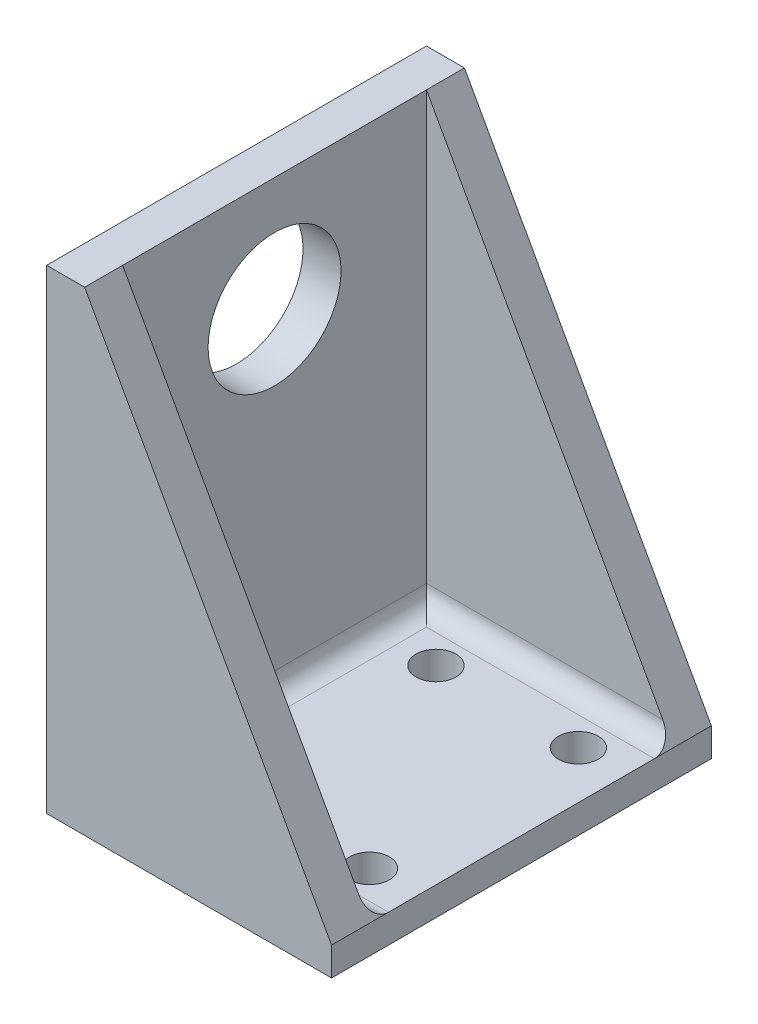
ISO-10303-21;
HEADER;
FILE_DESCRIPTION(('STEP AP214'),'2;1');
FILE_NAME('part.step','',(''),(''),'','','');
FILE_SCHEMA(('AUTOMOTIVE_DESIGN { 1 0 10303 214 1 1 1 1 }'));
ENDSEC;
DATA;
#1=APPLICATION_CONTEXT('core data for automotive mechanical design processes');
#2=APPLICATION_PROTOCOL_DEFINITION('international standard','automotive_design',2000,#1);
#3=PRODUCT_CONTEXT('',#1,'mechanical');
#4=PRODUCT('Part','Part','',(#3));
#5=PRODUCT_RELATED_PRODUCT_CATEGORY('part','',(#4));
#6=PRODUCT_DEFINITION_FORMATION('','',#4);
#7=PRODUCT_DEFINITION_CONTEXT('part definition',#1,'design');
#8=PRODUCT_DEFINITION('design','',#6,#7);
#9=PRODUCT_DEFINITION_SHAPE('','',#8);
#10=(LENGTH_UNIT() NAMED_UNIT(*) SI_UNIT(.MILLI.,.METRE.));
#11=(NAMED_UNIT(*) PLANE_ANGLE_UNIT() SI_UNIT($,.RADIAN.));
#12=(NAMED_UNIT(*) SI_UNIT($,.STERADIAN.) SOLID_ANGLE_UNIT());
#13=UNCERTAINTY_MEASURE_WITH_UNIT(LENGTH_MEASURE(1.E-05),#10,'distance_accuracy_value','');
#14=(GEOMETRIC_REPRESENTATION_CONTEXT(3) GLOBAL_UNCERTAINTY_ASSIGNED_CONTEXT((#13)) GLOBAL_UNIT_ASSIGNED_CONTEXT((#10,
#11,#12)) REPRESENTATION_CONTEXT('',''));
#15=CARTESIAN_POINT('',(0.,0.,0.));
#16=DIRECTION('',(0.,0.,1.));
#17=DIRECTION('',(1.,0.,0.));
#18=AXIS2_PLACEMENT_3D('',#15,#16,#17);
#19=CARTESIAN_POINT('',(0.,3.,0.));
#20=DIRECTION('',(0.,-1.,0.));
#21=DIRECTION('',(0.,0.,-1.));
#22=AXIS2_PLACEMENT_3D('',#19,#20,#21);
#23=PLANE('',#22);
#24=CARTESIAN_POINT('',(0.,3.,-11.));
#25=DIRECTION('',(0.,1.,0.));
#26=DIRECTION('',(0.,0.,1.));
#27=AXIS2_PLACEMENT_3D('',#24,#25,#26);
#28=CIRCLE('',#27,2.1);
#29=CARTESIAN_POINT('',(0.,3.,-8.90000000000001));
#30=VERTEX_POINT('',#29);
#31=EDGE_CURVE('E200',#30,#30,#28,.T.);
#32=ORIENTED_EDGE('',*,*,#31,.F.);
#33=EDGE_LOOP('',(#32));
#34=FACE_BOUND('',#33,.T.);
#35=CARTESIAN_POINT('',(15.,3.,11.));
#36=DIRECTION('',(0.,1.,0.));
#37=DIRECTION('',(0.,0.,1.));
#38=AXIS2_PLACEMENT_3D('',#35,#36,#37);
#39=CIRCLE('',#38,2.1);
#40=CARTESIAN_POINT('',(15.,3.,13.1));
#41=VERTEX_POINT('',#40);
#42=EDGE_CURVE('E192',#41,#41,#39,.T.);
#43=ORIENTED_EDGE('',*,*,#42,.F.);
#44=EDGE_LOOP('',(#43));
#45=FACE_BOUND('',#44,.T.);
#46=CARTESIAN_POINT('',(15.,3.,-11.));
#47=DIRECTION('',(0.,1.,0.));
#48=DIRECTION('',(0.,0.,-1.));
#49=AXIS2_PLACEMENT_3D('',#46,#47,#48);
#50=CIRCLE('',#49,2.1);
#51=CARTESIAN_POINT('',(15.,3.,-13.1));
#52=VERTEX_POINT('',#51);
#53=EDGE_CURVE('E184',#52,#52,#50,.T.);
#54=ORIENTED_EDGE('',*,*,#53,.F.);
#55=EDGE_LOOP('',(#54));
#56=FACE_BOUND('',#55,.T.);
#57=CARTESIAN_POINT('',(0.,3.,11.));
#58=DIRECTION('',(0.,1.,0.));
#59=DIRECTION('',(0.,0.,-1.));
#60=AXIS2_PLACEMENT_3D('',#57,#58,#59);
#61=CIRCLE('',#60,2.1);
#62=CARTESIAN_POINT('',(0.,3.,8.90000000000001));
#63=VERTEX_POINT('',#62);
#64=EDGE_CURVE('E176',#63,#63,#61,.T.);
#65=ORIENTED_EDGE('',*,*,#64,.F.);
#66=EDGE_LOOP('',(#65));
#67=FACE_BOUND('',#66,.T.);
#68=DIRECTION('',(0.,0.,-1.));
#69=VECTOR('',#68,1.);
#70=CARTESIAN_POINT('',(20.,3.,20.));
#71=LINE('',#70,#69);
#72=CARTESIAN_POINT('',(20.,3.,14.));
#73=VERTEX_POINT('',#72);
#74=CARTESIAN_POINT('',(20.,3.,-14.));
#75=VERTEX_POINT('',#74);
#76=EDGE_CURVE('E213',#73,#75,#71,.T.);
#77=ORIENTED_EDGE('',*,*,#76,.T.);
#78=DIRECTION('',(1.,0.,0.));
#79=VECTOR('',#78,1.);
#80=CARTESIAN_POINT('',(-5.99999999999999,3.,-14.));
#81=LINE('',#80,#79);
#82=CARTESIAN_POINT('',(-3.99999999999999,3.,-14.));
#83=VERTEX_POINT('',#82);
#84=EDGE_CURVE('E248',#75,#83,#81,.F.);
#85=ORIENTED_EDGE('',*,*,#84,.T.);
#86=DIRECTION('',(0.,0.,1.));
#87=VECTOR('',#86,1.);
#88=CARTESIAN_POINT('',(-3.99999999999999,3.,0.));
#89=LINE('',#88,#87);
#90=CARTESIAN_POINT('',(-3.99999999999999,3.,14.));
#91=VERTEX_POINT('',#90);
#92=EDGE_CURVE('E244',#83,#91,#89,.T.);
#93=ORIENTED_EDGE('',*,*,#92,.T.);
#94=DIRECTION('',(-1.,0.,0.));
#95=VECTOR('',#94,1.);
#96=CARTESIAN_POINT('',(20.,3.,14.));
#97=LINE('',#96,#95);
#98=EDGE_CURVE('E240',#91,#73,#97,.F.);
#99=ORIENTED_EDGE('',*,*,#98,.T.);
#100=EDGE_LOOP('',(#77,#85,#93,#99));
#101=FACE_BOUND('',#100,.T.);
#102=ADVANCED_FACE('F45',(#34,#45,#56,#67,#101),#23,.F.);
#103=CARTESIAN_POINT('',(-5.99999999999999,0.,0.));
#104=DIRECTION('',(1.,0.,0.));
#105=DIRECTION('',(0.,0.,-1.));
#106=AXIS2_PLACEMENT_3D('',#103,#104,#105);
#107=PLANE('',#106);
#108=CARTESIAN_POINT('',(-5.99999999999999,38.,0.));
#109=DIRECTION('',(-1.,0.,0.));
#110=DIRECTION('',(0.,0.,1.));
#111=AXIS2_PLACEMENT_3D('',#108,#109,#110);
#112=CIRCLE('',#111,7.);
#113=CARTESIAN_POINT('',(-5.99999999999999,38.,6.99999999999999));
#114=VERTEX_POINT('',#113);
#115=EDGE_CURVE('E163',#114,#114,#112,.T.);
#116=ORIENTED_EDGE('',*,*,#115,.T.);
#117=EDGE_LOOP('',(#116));
#118=FACE_BOUND('',#117,.T.);
#119=DIRECTION('',(0.,-1.,0.));
#120=VECTOR('',#119,1.);
#121=CARTESIAN_POINT('',(-5.99999999999999,0.,16.));
#122=LINE('',#121,#120);
#123=CARTESIAN_POINT('',(-5.99999999999999,50.,16.));
#124=VERTEX_POINT('',#123);
#125=CARTESIAN_POINT('',(-5.99999999999999,5.,16.));
#126=VERTEX_POINT('',#125);
#127=EDGE_CURVE('E276',#124,#126,#122,.T.);
#128=ORIENTED_EDGE('',*,*,#127,.T.);
#129=DIRECTION('',(0.,0.,1.));
#130=VECTOR('',#129,1.);
#131=CARTESIAN_POINT('',(-5.99999999999999,5.,0.));
#132=LINE('',#131,#130);
#133=CARTESIAN_POINT('',(-5.99999999999999,5.,-16.));
#134=VERTEX_POINT('',#133);
#135=EDGE_CURVE('E142',#126,#134,#132,.F.);
#136=ORIENTED_EDGE('',*,*,#135,.T.);
#137=DIRECTION('',(0.,1.,0.));
#138=VECTOR('',#137,1.);
#139=CARTESIAN_POINT('',(-5.99999999999999,0.,-16.));
#140=LINE('',#139,#138);
#141=CARTESIAN_POINT('',(-5.99999999999999,50.,-16.));
#142=VERTEX_POINT('',#141);
#143=EDGE_CURVE('E123',#134,#142,#140,.T.);
#144=ORIENTED_EDGE('',*,*,#143,.T.);
#145=DIRECTION('',(0.,0.,-1.));
#146=VECTOR('',#145,1.);
#147=CARTESIAN_POINT('',(-5.99999999999999,50.,-20.));
#148=LINE('',#147,#146);
#149=EDGE_CURVE('E139',#124,#142,#148,.T.);
#150=ORIENTED_EDGE('',*,*,#149,.F.);
#151=EDGE_LOOP('',(#128,#136,#144,#150));
#152=FACE_BOUND('',#151,.T.);
#153=ADVANCED_FACE('F137',(#118,#152),#107,.T.);
#154=CARTESIAN_POINT('',(0.,0.,0.));
#155=DIRECTION('',(0.,-1.,0.));
#156=DIRECTION('',(0.,0.,-1.));
#157=AXIS2_PLACEMENT_3D('',#154,#155,#156);
#158=PLANE('',#157);
#159=DIRECTION('',(-1.,0.,0.));
#160=VECTOR('',#159,1.);
#161=CARTESIAN_POINT('',(-9.99999999999999,0.,-20.));
#162=LINE('',#161,#160);
#163=CARTESIAN_POINT('',(20.,0.,-20.));
#164=VERTEX_POINT('',#163);
#165=CARTESIAN_POINT('',(-9.99999999999999,0.,-20.));
#166=VERTEX_POINT('',#165);
#167=EDGE_CURVE('E216',#164,#166,#162,.T.);
#168=ORIENTED_EDGE('',*,*,#167,.F.);
#169=DIRECTION('',(0.,0.,-1.));
#170=VECTOR('',#169,1.);
#171=CARTESIAN_POINT('',(20.,0.,20.));
#172=LINE('',#171,#170);
#173=CARTESIAN_POINT('',(20.,0.,20.));
#174=VERTEX_POINT('',#173);
#175=EDGE_CURVE('E204',#174,#164,#172,.T.);
#176=ORIENTED_EDGE('',*,*,#175,.F.);
#177=DIRECTION('',(1.,0.,0.));
#178=VECTOR('',#177,1.);
#179=CARTESIAN_POINT('',(-9.99999999999998,0.,20.));
#180=LINE('',#179,#178);
#181=CARTESIAN_POINT('',(-9.99999999999998,0.,20.));
#182=VERTEX_POINT('',#181);
#183=EDGE_CURVE('E222',#182,#174,#180,.T.);
#184=ORIENTED_EDGE('',*,*,#183,.F.);
#185=DIRECTION('',(0.,0.,1.));
#186=VECTOR('',#185,1.);
#187=CARTESIAN_POINT('',(-9.99999999999999,0.,-20.));
#188=LINE('',#187,#186);
#189=EDGE_CURVE('E219',#166,#182,#188,.T.);
#190=ORIENTED_EDGE('',*,*,#189,.F.);
#191=EDGE_LOOP('',(#168,#176,#184,#190));
#192=FACE_BOUND('',#191,.T.);
#193=CARTESIAN_POINT('',(15.,0.,-11.));
#194=DIRECTION('',(0.,1.,0.));
#195=DIRECTION('',(0.,0.,-1.));
#196=AXIS2_PLACEMENT_3D('',#193,#194,#195);
#197=CIRCLE('',#196,2.1);
#198=CARTESIAN_POINT('',(15.,0.,-13.1));
#199=VERTEX_POINT('',#198);
#200=EDGE_CURVE('E180',#199,#199,#197,.T.);
#201=ORIENTED_EDGE('',*,*,#200,.T.);
#202=EDGE_LOOP('',(#201));
#203=FACE_BOUND('',#202,.T.);
#204=CARTESIAN_POINT('',(0.,0.,-11.));
#205=DIRECTION('',(0.,1.,0.));
#206=DIRECTION('',(0.,0.,1.));
#207=AXIS2_PLACEMENT_3D('',#204,#205,#206);
#208=CIRCLE('',#207,2.1);
#209=CARTESIAN_POINT('',(0.,0.,-8.90000000000001));
#210=VERTEX_POINT('',#209);
#211=EDGE_CURVE('E196',#210,#210,#208,.T.);
#212=ORIENTED_EDGE('',*,*,#211,.T.);
#213=EDGE_LOOP('',(#212));
#214=FACE_BOUND('',#213,.T.);
#215=CARTESIAN_POINT('',(15.,0.,11.));
#216=DIRECTION('',(0.,1.,0.));
#217=DIRECTION('',(0.,0.,1.));
#218=AXIS2_PLACEMENT_3D('',#215,#216,#217);
#219=CIRCLE('',#218,2.1);
#220=CARTESIAN_POINT('',(15.,0.,13.1));
#221=VERTEX_POINT('',#220);
#222=EDGE_CURVE('E188',#221,#221,#219,.T.);
#223=ORIENTED_EDGE('',*,*,#222,.T.);
#224=EDGE_LOOP('',(#223));
#225=FACE_BOUND('',#224,.T.);
#226=CARTESIAN_POINT('',(0.,0.,11.));
#227=DIRECTION('',(0.,1.,0.));
#228=DIRECTION('',(0.,0.,-1.));
#229=AXIS2_PLACEMENT_3D('',#226,#227,#228);
#230=CIRCLE('',#229,2.1);
#231=CARTESIAN_POINT('',(0.,0.,8.90000000000001));
#232=VERTEX_POINT('',#231);
#233=EDGE_CURVE('E172',#232,#232,#230,.T.);
#234=ORIENTED_EDGE('',*,*,#233,.T.);
#235=EDGE_LOOP('',(#234));
#236=FACE_BOUND('',#235,.T.);
#237=ADVANCED_FACE('F314',(#192,#203,#214,#225,#236),#158,.T.);
#238=CARTESIAN_POINT('',(20.,3.,20.));
#239=DIRECTION('',(-1.,0.,0.));
#240=DIRECTION('',(0.,0.,1.));
#241=AXIS2_PLACEMENT_3D('',#238,#239,#240);
#242=PLANE('',#241);
#243=DIRECTION('',(0.,0.,-1.));
#244=VECTOR('',#243,1.);
#245=CARTESIAN_POINT('',(20.,3.,-16.));
#246=LINE('',#245,#244);
#247=CARTESIAN_POINT('',(20.,3.,-20.));
#248=VERTEX_POINT('',#247);
#249=EDGE_CURVE('E64',#75,#248,#246,.T.);
#250=ORIENTED_EDGE('',*,*,#249,.F.);
#251=ORIENTED_EDGE('',*,*,#76,.F.);
#252=CARTESIAN_POINT('',(20.,3.,20.));
#253=VERTEX_POINT('',#252);
#254=EDGE_CURVE('E208',#253,#73,#71,.T.);
#255=ORIENTED_EDGE('',*,*,#254,.F.);
#256=DIRECTION('',(0.,-1.,0.));
#257=VECTOR('',#256,1.);
#258=CARTESIAN_POINT('',(20.,3.,20.));
#259=LINE('',#258,#257);
#260=EDGE_CURVE('E212',#253,#174,#259,.T.);
#261=ORIENTED_EDGE('',*,*,#260,.T.);
#262=ORIENTED_EDGE('',*,*,#175,.T.);
#263=DIRECTION('',(0.,-1.,0.));
#264=VECTOR('',#263,1.);
#265=CARTESIAN_POINT('',(20.,3.,-20.));
#266=LINE('',#265,#264);
#267=EDGE_CURVE('E236',#248,#164,#266,.T.);
#268=ORIENTED_EDGE('',*,*,#267,.F.);
#269=EDGE_LOOP('',(#250,#251,#255,#261,#262,#268));
#270=FACE_BOUND('',#269,.T.);
#271=ADVANCED_FACE('F305',(#270),#242,.F.);
#272=CARTESIAN_POINT('',(-9.99999999999999,3.,-20.));
#273=DIRECTION('',(0.,0.,1.));
#274=DIRECTION('',(1.,0.,0.));
#275=AXIS2_PLACEMENT_3D('',#272,#273,#274);
#276=PLANE('',#275);
#277=ORIENTED_EDGE('',*,*,#167,.T.);
#278=DIRECTION('',(0.,-1.,0.));
#279=VECTOR('',#278,1.);
#280=CARTESIAN_POINT('',(-9.99999999999999,3.,-20.));
#281=LINE('',#280,#279);
#282=CARTESIAN_POINT('',(-9.99999999999999,50.,-20.));
#283=VERTEX_POINT('',#282);
#284=EDGE_CURVE('E232',#283,#166,#281,.T.);
#285=ORIENTED_EDGE('',*,*,#284,.F.);
#286=DIRECTION('',(-1.,0.,0.));
#287=VECTOR('',#286,1.);
#288=CARTESIAN_POINT('',(-5.99999999999999,50.,-20.));
#289=LINE('',#288,#287);
#290=CARTESIAN_POINT('',(-5.99999999999999,50.,-20.));
#291=VERTEX_POINT('',#290);
#292=EDGE_CURVE('E169',#291,#283,#289,.T.);
#293=ORIENTED_EDGE('',*,*,#292,.F.);
#294=DIRECTION('',(-0.484061385167266,0.87503404241775,0.));
#295=VECTOR('',#294,1.);
#296=CARTESIAN_POINT('',(20.,3.,-20.));
#297=LINE('',#296,#295);
#298=EDGE_CURVE('E132',#248,#291,#297,.T.);
#299=ORIENTED_EDGE('',*,*,#298,.F.);
#300=ORIENTED_EDGE('',*,*,#267,.T.);
#301=EDGE_LOOP('',(#277,#285,#293,#299,#300));
#302=FACE_BOUND('',#301,.T.);
#303=ADVANCED_FACE('F294',(#302),#276,.F.);
#304=CARTESIAN_POINT('',(-9.99999999999999,3.,-20.));
#305=DIRECTION('',(1.,0.,0.));
#306=DIRECTION('',(0.,0.,-1.));
#307=AXIS2_PLACEMENT_3D('',#304,#305,#306);
#308=PLANE('',#307);
#309=ORIENTED_EDGE('',*,*,#189,.T.);
#310=DIRECTION('',(0.,-1.,0.));
#311=VECTOR('',#310,1.);
#312=CARTESIAN_POINT('',(-9.99999999999998,3.,20.));
#313=LINE('',#312,#311);
#314=CARTESIAN_POINT('',(-9.99999999999999,50.,20.));
#315=VERTEX_POINT('',#314);
#316=EDGE_CURVE('E228',#315,#182,#313,.T.);
#317=ORIENTED_EDGE('',*,*,#316,.F.);
#318=DIRECTION('',(0.,0.,-1.));
#319=VECTOR('',#318,1.);
#320=CARTESIAN_POINT('',(-9.99999999999999,50.,-20.));
#321=LINE('',#320,#319);
#322=EDGE_CURVE('E158',#315,#283,#321,.T.);
#323=ORIENTED_EDGE('',*,*,#322,.T.);
#324=ORIENTED_EDGE('',*,*,#284,.T.);
#325=EDGE_LOOP('',(#309,#317,#323,#324));
#326=FACE_BOUND('',#325,.T.);
#327=CARTESIAN_POINT('',(-9.99999999999999,38.,0.));
#328=DIRECTION('',(-1.,0.,0.));
#329=DIRECTION('',(0.,0.,1.));
#330=AXIS2_PLACEMENT_3D('',#327,#328,#329);
#331=CIRCLE('',#330,7.);
#332=CARTESIAN_POINT('',(-9.99999999999999,38.,6.99999999999999));
#333=VERTEX_POINT('',#332);
#334=EDGE_CURVE('E166',#333,#333,#331,.T.);
#335=ORIENTED_EDGE('',*,*,#334,.F.);
#336=EDGE_LOOP('',(#335));
#337=FACE_BOUND('',#336,.T.);
#338=ADVANCED_FACE('F291',(#326,#337),#308,.F.);
#339=CARTESIAN_POINT('',(-9.99999999999998,3.,20.));
#340=DIRECTION('',(0.,0.,-1.));
#341=DIRECTION('',(-1.,0.,0.));
#342=AXIS2_PLACEMENT_3D('',#339,#340,#341);
#343=PLANE('',#342);
#344=ORIENTED_EDGE('',*,*,#260,.F.);
#345=DIRECTION('',(-0.484061385167266,0.87503404241775,0.));
#346=VECTOR('',#345,1.);
#347=CARTESIAN_POINT('',(20.,3.,20.));
#348=LINE('',#347,#346);
#349=CARTESIAN_POINT('',(-5.99999999999999,50.,20.));
#350=VERTEX_POINT('',#349);
#351=EDGE_CURVE('E144',#253,#350,#348,.T.);
#352=ORIENTED_EDGE('',*,*,#351,.T.);
#353=DIRECTION('',(-1.,0.,0.));
#354=VECTOR('',#353,1.);
#355=CARTESIAN_POINT('',(-5.99999999999999,50.,20.));
#356=LINE('',#355,#354);
#357=EDGE_CURVE('E162',#350,#315,#356,.T.);
#358=ORIENTED_EDGE('',*,*,#357,.T.);
#359=ORIENTED_EDGE('',*,*,#316,.T.);
#360=ORIENTED_EDGE('',*,*,#183,.T.);
#361=EDGE_LOOP('',(#344,#352,#358,#359,#360));
#362=FACE_BOUND('',#361,.T.);
#363=ADVANCED_FACE('F293',(#362),#343,.F.);
#364=CARTESIAN_POINT('',(0.,3.,-11.));
#365=DIRECTION('',(0.,-1.,0.));
#366=DIRECTION('',(0.,0.,-1.));
#367=AXIS2_PLACEMENT_3D('',#364,#365,#366);
#368=CYLINDRICAL_SURFACE('',#367,2.1);
#369=ORIENTED_EDGE('',*,*,#31,.T.);
#370=EDGE_LOOP('',(#369));
#371=FACE_BOUND('',#370,.T.);
#372=ORIENTED_EDGE('',*,*,#211,.F.);
#373=EDGE_LOOP('',(#372));
#374=FACE_BOUND('',#373,.T.);
#375=ADVANCED_FACE('F302',(#371,#374),#368,.F.);
#376=CARTESIAN_POINT('',(15.,3.,11.));
#377=DIRECTION('',(0.,-1.,0.));
#378=DIRECTION('',(0.,0.,-1.));
#379=AXIS2_PLACEMENT_3D('',#376,#377,#378);
#380=CYLINDRICAL_SURFACE('',#379,2.1);
#381=ORIENTED_EDGE('',*,*,#42,.T.);
#382=EDGE_LOOP('',(#381));
#383=FACE_BOUND('',#382,.T.);
#384=ORIENTED_EDGE('',*,*,#222,.F.);
#385=EDGE_LOOP('',(#384));
#386=FACE_BOUND('',#385,.T.);
#387=ADVANCED_FACE('F349',(#383,#386),#380,.F.);
#388=CARTESIAN_POINT('',(15.,3.,-11.));
#389=DIRECTION('',(0.,-1.,0.));
#390=DIRECTION('',(0.,0.,-1.));
#391=AXIS2_PLACEMENT_3D('',#388,#389,#390);
#392=CYLINDRICAL_SURFACE('',#391,2.1);
#393=ORIENTED_EDGE('',*,*,#53,.T.);
#394=EDGE_LOOP('',(#393));
#395=FACE_BOUND('',#394,.T.);
#396=ORIENTED_EDGE('',*,*,#200,.F.);
#397=EDGE_LOOP('',(#396));
#398=FACE_BOUND('',#397,.T.);
#399=ADVANCED_FACE('F341',(#395,#398),#392,.F.);
#400=CARTESIAN_POINT('',(0.,3.,11.));
#401=DIRECTION('',(0.,-1.,0.));
#402=DIRECTION('',(0.,0.,-1.));
#403=AXIS2_PLACEMENT_3D('',#400,#401,#402);
#404=CYLINDRICAL_SURFACE('',#403,2.1);
#405=ORIENTED_EDGE('',*,*,#64,.T.);
#406=EDGE_LOOP('',(#405));
#407=FACE_BOUND('',#406,.T.);
#408=ORIENTED_EDGE('',*,*,#233,.F.);
#409=EDGE_LOOP('',(#408));
#410=FACE_BOUND('',#409,.T.);
#411=ADVANCED_FACE('F339',(#407,#410),#404,.F.);
#412=CARTESIAN_POINT('',(-5.99999999999999,50.,-20.));
#413=DIRECTION('',(0.,1.,0.));
#414=DIRECTION('',(0.,0.,1.));
#415=AXIS2_PLACEMENT_3D('',#412,#413,#414);
#416=PLANE('',#415);
#417=ORIENTED_EDGE('',*,*,#292,.T.);
#418=ORIENTED_EDGE('',*,*,#322,.F.);
#419=ORIENTED_EDGE('',*,*,#357,.F.);
#420=EDGE_CURVE('E156',#350,#124,#148,.T.);
#421=ORIENTED_EDGE('',*,*,#420,.T.);
#422=ORIENTED_EDGE('',*,*,#149,.T.);
#423=DIRECTION('',(0.,0.,-1.));
#424=VECTOR('',#423,1.);
#425=CARTESIAN_POINT('',(-5.99999999999999,50.,-16.));
#426=LINE('',#425,#424);
#427=EDGE_CURVE('E131',#142,#291,#426,.T.);
#428=ORIENTED_EDGE('',*,*,#427,.T.);
#429=EDGE_LOOP('',(#417,#418,#419,#421,#422,#428));
#430=FACE_BOUND('',#429,.T.);
#431=ADVANCED_FACE('F154',(#430),#416,.T.);
#432=CARTESIAN_POINT('',(-5.99999999999999,38.,0.));
#433=DIRECTION('',(-1.,0.,0.));
#434=DIRECTION('',(0.,0.,1.));
#435=AXIS2_PLACEMENT_3D('',#432,#433,#434);
#436=CYLINDRICAL_SURFACE('',#435,7.);
#437=ORIENTED_EDGE('',*,*,#115,.F.);
#438=EDGE_LOOP('',(#437));
#439=FACE_BOUND('',#438,.T.);
#440=ORIENTED_EDGE('',*,*,#334,.T.);
#441=EDGE_LOOP('',(#440));
#442=FACE_BOUND('',#441,.T.);
#443=ADVANCED_FACE('F289',(#439,#442),#436,.F.);
#444=CARTESIAN_POINT('',(0.,0.,16.));
#445=DIRECTION('',(0.,0.,1.));
#446=DIRECTION('',(1.,0.,0.));
#447=AXIS2_PLACEMENT_3D('',#444,#445,#446);
#448=PLANE('',#447);
#449=DIRECTION('',(-0.484061385167266,0.87503404241775,0.));
#450=VECTOR('',#449,1.);
#451=CARTESIAN_POINT('',(20.,3.,16.));
#452=LINE('',#451,#450);
#453=CARTESIAN_POINT('',(18.8936170212766,5.,16.));
#454=VERTEX_POINT('',#453);
#455=EDGE_CURVE('E273',#454,#124,#452,.T.);
#456=ORIENTED_EDGE('',*,*,#455,.F.);
#457=DIRECTION('',(-1.,0.,0.));
#458=VECTOR('',#457,1.);
#459=CARTESIAN_POINT('',(-5.99999999999999,5.,16.));
#460=LINE('',#459,#458);
#461=EDGE_CURVE('E255',#454,#126,#460,.T.);
#462=ORIENTED_EDGE('',*,*,#461,.T.);
#463=ORIENTED_EDGE('',*,*,#127,.F.);
#464=EDGE_LOOP('',(#456,#462,#463));
#465=FACE_BOUND('',#464,.T.);
#466=ADVANCED_FACE('F387',(#465),#448,.F.);
#467=CARTESIAN_POINT('',(20.,3.,16.));
#468=DIRECTION('',(0.87503404241775,0.484061385167266,0.));
#469=DIRECTION('',(-0.484061385167266,0.87503404241775,0.));
#470=AXIS2_PLACEMENT_3D('',#467,#468,#469);
#471=PLANE('',#470);
#472=ORIENTED_EDGE('',*,*,#351,.F.);
#473=ORIENTED_EDGE('',*,*,#254,.T.);
#474=CARTESIAN_POINT('',(18.8936170212766,5.,14.));
#475=DIRECTION('',(0.87503404241775,0.484061385167266,0.));
#476=DIRECTION('',(0.484061385167266,-0.87503404241775,0.));
#477=AXIS2_PLACEMENT_3D('',#474,#475,#476);
#478=ELLIPSE('',#477,2.28562536204184,2.);
#479=EDGE_CURVE('E11',#73,#454,#478,.F.);
#480=ORIENTED_EDGE('',*,*,#479,.T.);
#481=ORIENTED_EDGE('',*,*,#455,.T.);
#482=ORIENTED_EDGE('',*,*,#420,.F.);
#483=EDGE_LOOP('',(#472,#473,#480,#481,#482));
#484=FACE_BOUND('',#483,.T.);
#485=ADVANCED_FACE('F384',(#484),#471,.T.);
#486=CARTESIAN_POINT('',(0.,0.,-16.));
#487=DIRECTION('',(0.,0.,-1.));
#488=DIRECTION('',(1.,0.,0.));
#489=AXIS2_PLACEMENT_3D('',#486,#487,#488);
#490=PLANE('',#489);
#491=ORIENTED_EDGE('',*,*,#143,.F.);
#492=DIRECTION('',(1.,0.,0.));
#493=VECTOR('',#492,1.);
#494=CARTESIAN_POINT('',(20.,5.,-16.));
#495=LINE('',#494,#493);
#496=CARTESIAN_POINT('',(18.8936170212766,5.,-16.));
#497=VERTEX_POINT('',#496);
#498=EDGE_CURVE('E125',#134,#497,#495,.T.);
#499=ORIENTED_EDGE('',*,*,#498,.T.);
#500=DIRECTION('',(-0.484061385167266,0.87503404241775,0.));
#501=VECTOR('',#500,1.);
#502=CARTESIAN_POINT('',(20.,3.,-16.));
#503=LINE('',#502,#501);
#504=EDGE_CURVE('E120',#497,#142,#503,.T.);
#505=ORIENTED_EDGE('',*,*,#504,.T.);
#506=EDGE_LOOP('',(#491,#499,#505));
#507=FACE_BOUND('',#506,.T.);
#508=ADVANCED_FACE('F122',(#507),#490,.F.);
#509=CARTESIAN_POINT('',(20.,3.,-16.));
#510=DIRECTION('',(-0.87503404241775,-0.484061385167266,0.));
#511=DIRECTION('',(0.484061385167266,-0.87503404241775,0.));
#512=AXIS2_PLACEMENT_3D('',#509,#510,#511);
#513=PLANE('',#512);
#514=ORIENTED_EDGE('',*,*,#298,.T.);
#515=ORIENTED_EDGE('',*,*,#427,.F.);
#516=ORIENTED_EDGE('',*,*,#504,.F.);
#517=CARTESIAN_POINT('',(18.8936170212766,5.,-14.));
#518=DIRECTION('',(-0.87503404241775,-0.484061385167266,0.));
#519=DIRECTION('',(-0.484061385167266,0.87503404241775,0.));
#520=AXIS2_PLACEMENT_3D('',#517,#518,#519);
#521=ELLIPSE('',#520,2.28562536204184,2.);
#522=EDGE_CURVE('E56',#497,#75,#521,.T.);
#523=ORIENTED_EDGE('',*,*,#522,.T.);
#524=ORIENTED_EDGE('',*,*,#249,.T.);
#525=EDGE_LOOP('',(#514,#515,#516,#523,#524));
#526=FACE_BOUND('',#525,.T.);
#527=ADVANCED_FACE('F147',(#526),#513,.F.);
#528=CARTESIAN_POINT('',(0.,5.,-14.));
#529=DIRECTION('',(-1.,0.,0.));
#530=DIRECTION('',(0.,0.,1.));
#531=AXIS2_PLACEMENT_3D('',#528,#529,#530);
#532=CYLINDRICAL_SURFACE('',#531,2.);
#533=ORIENTED_EDGE('',*,*,#522,.F.);
#534=ORIENTED_EDGE('',*,*,#498,.F.);
#535=CARTESIAN_POINT('',(-3.99999999999999,5.,-14.));
#536=DIRECTION('',(-0.707106781186547,0.,0.707106781186547));
#537=DIRECTION('',(0.707106781186547,0.,0.707106781186547));
#538=AXIS2_PLACEMENT_3D('',#535,#536,#537);
#539=ELLIPSE('',#538,2.82842712474619,2.);
#540=EDGE_CURVE('E49',#83,#134,#539,.F.);
#541=ORIENTED_EDGE('',*,*,#540,.F.);
#542=ORIENTED_EDGE('',*,*,#84,.F.);
#543=EDGE_LOOP('',(#533,#534,#541,#542));
#544=FACE_BOUND('',#543,.T.);
#545=ADVANCED_FACE('F47',(#544),#532,.F.);
#546=CARTESIAN_POINT('',(0.,5.,14.));
#547=DIRECTION('',(1.,0.,0.));
#548=DIRECTION('',(0.,0.,-1.));
#549=AXIS2_PLACEMENT_3D('',#546,#547,#548);
#550=CYLINDRICAL_SURFACE('',#549,2.);
#551=ORIENTED_EDGE('',*,*,#479,.F.);
#552=ORIENTED_EDGE('',*,*,#98,.F.);
#553=CARTESIAN_POINT('',(-3.99999999999999,5.,14.));
#554=DIRECTION('',(0.707106781186547,0.,0.707106781186547));
#555=DIRECTION('',(-0.707106781186547,0.,0.707106781186547));
#556=AXIS2_PLACEMENT_3D('',#553,#554,#555);
#557=ELLIPSE('',#556,2.82842712474619,2.);
#558=EDGE_CURVE('E259',#126,#91,#557,.T.);
#559=ORIENTED_EDGE('',*,*,#558,.F.);
#560=ORIENTED_EDGE('',*,*,#461,.F.);
#561=EDGE_LOOP('',(#551,#552,#559,#560));
#562=FACE_BOUND('',#561,.T.);
#563=ADVANCED_FACE('F372',(#562),#550,.F.);
#564=CARTESIAN_POINT('',(-3.99999999999999,5.,0.));
#565=DIRECTION('',(0.,0.,1.));
#566=DIRECTION('',(1.,0.,0.));
#567=AXIS2_PLACEMENT_3D('',#564,#565,#566);
#568=CYLINDRICAL_SURFACE('',#567,2.);
#569=ORIENTED_EDGE('',*,*,#540,.T.);
#570=ORIENTED_EDGE('',*,*,#135,.F.);
#571=ORIENTED_EDGE('',*,*,#558,.T.);
#572=ORIENTED_EDGE('',*,*,#92,.F.);
#573=EDGE_LOOP('',(#569,#570,#571,#572));
#574=FACE_BOUND('',#573,.T.);
#575=ADVANCED_FACE('F370',(#574),#568,.F.);
#576=CLOSED_SHELL('',(#102,#153,#237,#271,#303,#338,#363,#375,#387,#399,#411,#431,#443,#466,
#485,#508,#527,#545,#563,#575));
#577=MANIFOLD_SOLID_BREP('B2',#576);
#578=ADVANCED_BREP_SHAPE_REPRESENTATION('',(#18,#577),#14);
#579=SHAPE_DEFINITION_REPRESENTATION(#9,#578);
ENDSEC;
END-ISO-10303-21;
